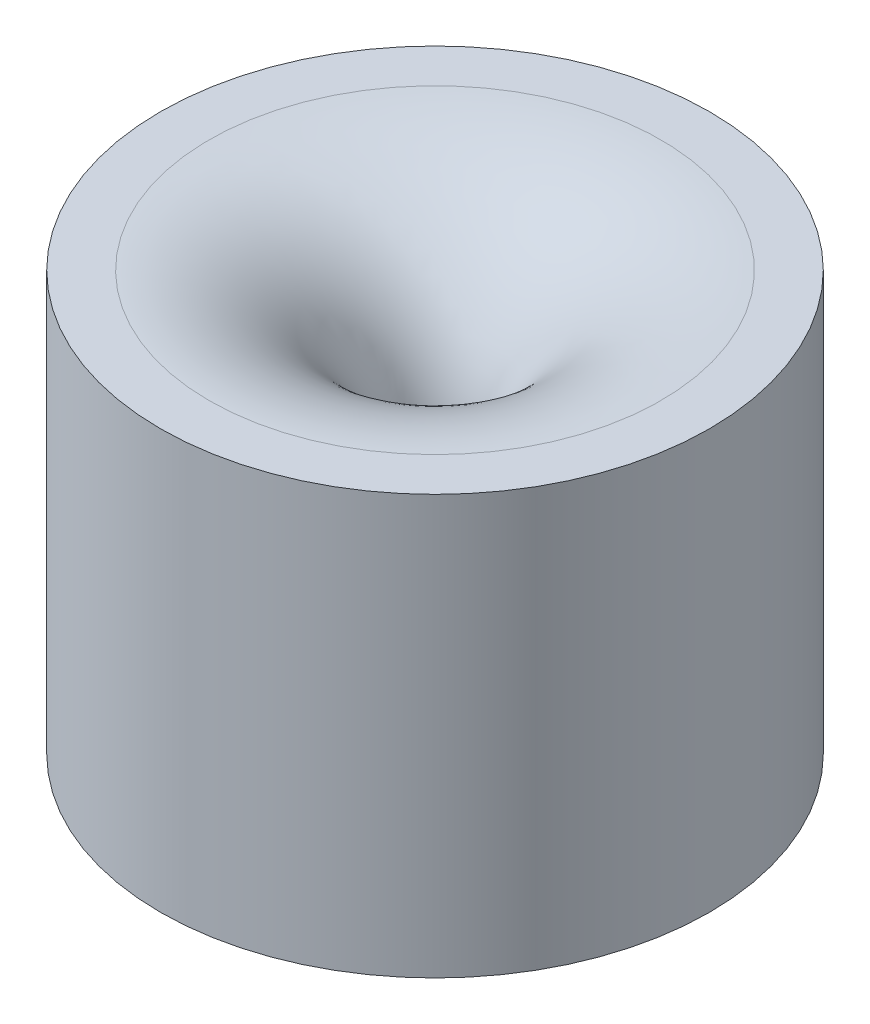
ISO-10303-21;
HEADER;
FILE_DESCRIPTION(('STEP AP214'),'2;1');
FILE_NAME('part.step','',(''),(''),'','','');
FILE_SCHEMA(('AUTOMOTIVE_DESIGN { 1 0 10303 214 1 1 1 1 }'));
ENDSEC;
DATA;
#1=APPLICATION_CONTEXT('core data for automotive mechanical design processes');
#2=APPLICATION_PROTOCOL_DEFINITION('international standard','automotive_design',2000,#1);
#3=PRODUCT_CONTEXT('',#1,'mechanical');
#4=PRODUCT('Part','Part','',(#3));
#5=PRODUCT_RELATED_PRODUCT_CATEGORY('part','',(#4));
#6=PRODUCT_DEFINITION_FORMATION('','',#4);
#7=PRODUCT_DEFINITION_CONTEXT('part definition',#1,'design');
#8=PRODUCT_DEFINITION('design','',#6,#7);
#9=PRODUCT_DEFINITION_SHAPE('','',#8);
#10=(LENGTH_UNIT() NAMED_UNIT(*) SI_UNIT(.MILLI.,.METRE.));
#11=(NAMED_UNIT(*) PLANE_ANGLE_UNIT() SI_UNIT($,.RADIAN.));
#12=(NAMED_UNIT(*) SI_UNIT($,.STERADIAN.) SOLID_ANGLE_UNIT());
#13=UNCERTAINTY_MEASURE_WITH_UNIT(LENGTH_MEASURE(1.E-05),#10,'distance_accuracy_value','');
#14=(GEOMETRIC_REPRESENTATION_CONTEXT(3) GLOBAL_UNCERTAINTY_ASSIGNED_CONTEXT((#13)) GLOBAL_UNIT_ASSIGNED_CONTEXT((#10,
#11,#12)) REPRESENTATION_CONTEXT('',''));
#15=CARTESIAN_POINT('',(0.,0.,0.));
#16=DIRECTION('',(0.,0.,1.));
#17=DIRECTION('',(1.,0.,0.));
#18=AXIS2_PLACEMENT_3D('',#15,#16,#17);
#19=CARTESIAN_POINT('',(0.,44.5,0.));
#20=DIRECTION('',(0.,1.,0.));
#21=DIRECTION('',(0.,0.,1.));
#22=AXIS2_PLACEMENT_3D('',#19,#20,#21);
#23=PLANE('',#22);
#24=CARTESIAN_POINT('',(0.,44.5,0.));
#25=DIRECTION('',(0.,1.,0.));
#26=DIRECTION('',(0.,0.,1.));
#27=AXIS2_PLACEMENT_3D('',#24,#25,#26);
#28=CIRCLE('',#27,24.);
#29=CARTESIAN_POINT('',(0.,44.5,24.));
#30=VERTEX_POINT('',#29);
#31=EDGE_CURVE('E10',#30,#30,#28,.F.);
#32=ORIENTED_EDGE('',*,*,#31,.T.);
#33=EDGE_LOOP('',(#32));
#34=FACE_BOUND('',#33,.T.);
#35=CARTESIAN_POINT('',(0.,44.5,0.));
#36=DIRECTION('',(0.,1.,0.));
#37=DIRECTION('',(0.,0.,1.));
#38=AXIS2_PLACEMENT_3D('',#35,#36,#37);
#39=CIRCLE('',#38,29.175);
#40=CARTESIAN_POINT('',(0.,44.5,29.175));
#41=VERTEX_POINT('',#40);
#42=EDGE_CURVE('E51',#41,#41,#39,.T.);
#43=ORIENTED_EDGE('',*,*,#42,.T.);
#44=EDGE_LOOP('',(#43));
#45=FACE_BOUND('',#44,.T.);
#46=ADVANCED_FACE('F40',(#34,#45),#23,.T.);
#47=CARTESIAN_POINT('',(0.,0.,0.));
#48=DIRECTION('',(0.,1.,0.));
#49=DIRECTION('',(0.,0.,1.));
#50=AXIS2_PLACEMENT_3D('',#47,#48,#49);
#51=PLANE('',#50);
#52=CARTESIAN_POINT('',(0.,0.,0.));
#53=DIRECTION('',(0.,1.,0.));
#54=DIRECTION('',(0.,0.,1.));
#55=AXIS2_PLACEMENT_3D('',#52,#53,#54);
#56=CIRCLE('',#55,29.175);
#57=CARTESIAN_POINT('',(0.,0.,29.175));
#58=VERTEX_POINT('',#57);
#59=EDGE_CURVE('E55',#58,#58,#56,.T.);
#60=ORIENTED_EDGE('',*,*,#59,.F.);
#61=EDGE_LOOP('',(#60));
#62=FACE_BOUND('',#61,.T.);
#63=CARTESIAN_POINT('',(0.,0.,0.));
#64=DIRECTION('',(0.,1.,0.));
#65=DIRECTION('',(0.,0.,1.));
#66=AXIS2_PLACEMENT_3D('',#63,#64,#65);
#67=CIRCLE('',#66,4.);
#68=CARTESIAN_POINT('',(0.,0.,4.));
#69=VERTEX_POINT('',#68);
#70=EDGE_CURVE('E59',#69,#69,#67,.T.);
#71=ORIENTED_EDGE('',*,*,#70,.T.);
#72=EDGE_LOOP('',(#71));
#73=FACE_BOUND('',#72,.T.);
#74=ADVANCED_FACE('F64',(#62,#73),#51,.F.);
#75=CARTESIAN_POINT('',(0.,44.5,0.));
#76=DIRECTION('',(0.,-1.,0.));
#77=DIRECTION('',(0.,0.,-1.));
#78=AXIS2_PLACEMENT_3D('',#75,#76,#77);
#79=CYLINDRICAL_SURFACE('',#78,29.175);
#80=ORIENTED_EDGE('',*,*,#42,.F.);
#81=EDGE_LOOP('',(#80));
#82=FACE_BOUND('',#81,.T.);
#83=ORIENTED_EDGE('',*,*,#59,.T.);
#84=EDGE_LOOP('',(#83));
#85=FACE_BOUND('',#84,.T.);
#86=ADVANCED_FACE('F68',(#82,#85),#79,.T.);
#87=CARTESIAN_POINT('',(0.,44.5,0.));
#88=DIRECTION('',(0.,-1.,0.));
#89=DIRECTION('',(0.,0.,-1.));
#90=AXIS2_PLACEMENT_3D('',#87,#88,#89);
#91=CYLINDRICAL_SURFACE('',#90,4.);
#92=CARTESIAN_POINT('',(0.,24.5,0.));
#93=DIRECTION('',(0.,1.,0.));
#94=DIRECTION('',(0.,0.,1.));
#95=AXIS2_PLACEMENT_3D('',#92,#93,#94);
#96=CIRCLE('',#95,4.);
#97=CARTESIAN_POINT('',(0.,24.5,4.));
#98=VERTEX_POINT('',#97);
#99=EDGE_CURVE('E47',#98,#98,#96,.T.);
#100=ORIENTED_EDGE('',*,*,#99,.T.);
#101=EDGE_LOOP('',(#100));
#102=FACE_BOUND('',#101,.T.);
#103=ORIENTED_EDGE('',*,*,#70,.F.);
#104=EDGE_LOOP('',(#103));
#105=FACE_BOUND('',#104,.T.);
#106=ADVANCED_FACE('F66',(#102,#105),#91,.F.);
#107=CARTESIAN_POINT('',(0.,24.5,0.));
#108=DIRECTION('',(0.,1.,0.));
#109=DIRECTION('',(0.,0.,1.));
#110=AXIS2_PLACEMENT_3D('',#107,#108,#109);
#111=TOROIDAL_SURFACE('',#110,24.,20.);
#112=ORIENTED_EDGE('',*,*,#31,.F.);
#113=EDGE_LOOP('',(#112));
#114=FACE_BOUND('',#113,.T.);
#115=ORIENTED_EDGE('',*,*,#99,.F.);
#116=EDGE_LOOP('',(#115));
#117=FACE_BOUND('',#116,.T.);
#118=ADVANCED_FACE('F42',(#114,#117),#111,.T.);
#119=CLOSED_SHELL('',(#46,#74,#86,#106,#118));
#120=MANIFOLD_SOLID_BREP('B2',#119);
#121=ADVANCED_BREP_SHAPE_REPRESENTATION('',(#18,#120),#14);
#122=SHAPE_DEFINITION_REPRESENTATION(#9,#121);
ENDSEC;
END-ISO-10303-21;
